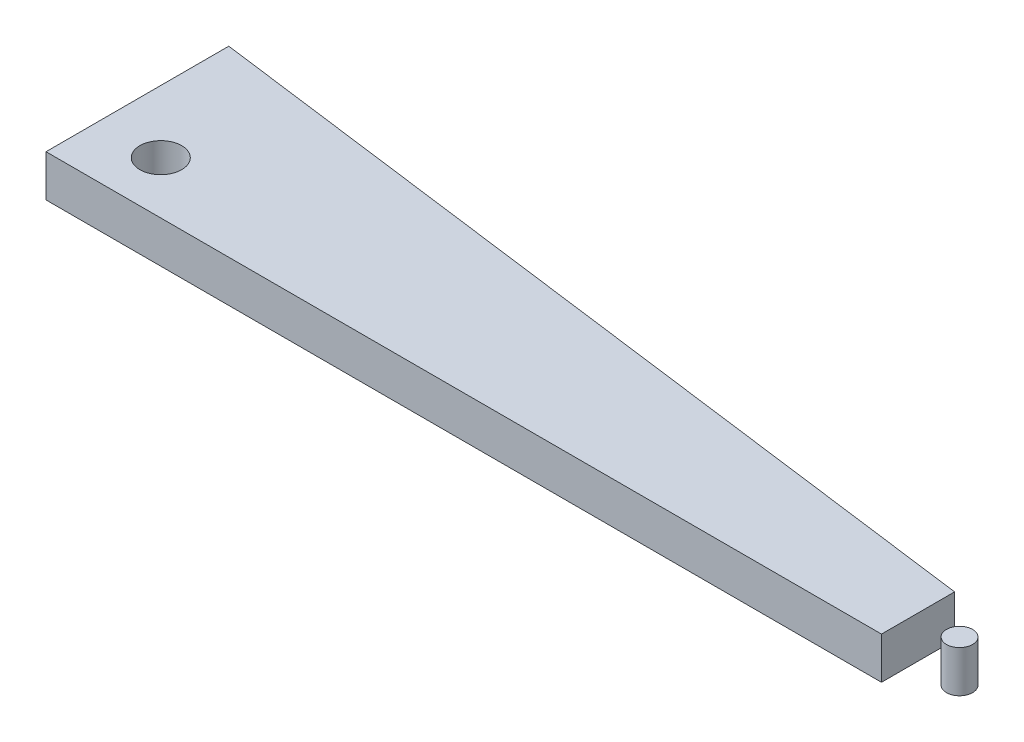
ISO-10303-21;
HEADER;
FILE_DESCRIPTION(('STEP AP214'),'2;1');
FILE_NAME('part.step','',(''),(''),'','','');
FILE_SCHEMA(('AUTOMOTIVE_DESIGN { 1 0 10303 214 1 1 1 1 }'));
ENDSEC;
DATA;
#1=APPLICATION_CONTEXT('core data for automotive mechanical design processes');
#2=APPLICATION_PROTOCOL_DEFINITION('international standard','automotive_design',2000,#1);
#3=PRODUCT_CONTEXT('',#1,'mechanical');
#4=PRODUCT('Part','Part','',(#3));
#5=PRODUCT_RELATED_PRODUCT_CATEGORY('part','',(#4));
#6=PRODUCT_DEFINITION_FORMATION('','',#4);
#7=PRODUCT_DEFINITION_CONTEXT('part definition',#1,'design');
#8=PRODUCT_DEFINITION('design','',#6,#7);
#9=PRODUCT_DEFINITION_SHAPE('','',#8);
#10=(LENGTH_UNIT() NAMED_UNIT(*) SI_UNIT(.MILLI.,.METRE.));
#11=(NAMED_UNIT(*) PLANE_ANGLE_UNIT() SI_UNIT($,.RADIAN.));
#12=(NAMED_UNIT(*) SI_UNIT($,.STERADIAN.) SOLID_ANGLE_UNIT());
#13=UNCERTAINTY_MEASURE_WITH_UNIT(LENGTH_MEASURE(1.E-05),#10,'distance_accuracy_value','');
#14=(GEOMETRIC_REPRESENTATION_CONTEXT(3) GLOBAL_UNCERTAINTY_ASSIGNED_CONTEXT((#13)) GLOBAL_UNIT_ASSIGNED_CONTEXT((#10,
#11,#12)) REPRESENTATION_CONTEXT('',''));
#15=CARTESIAN_POINT('',(0.,0.,0.));
#16=DIRECTION('',(0.,0.,1.));
#17=DIRECTION('',(1.,0.,0.));
#18=AXIS2_PLACEMENT_3D('',#15,#16,#17);
#19=CARTESIAN_POINT('',(167.947390467735,8.,-7.));
#20=DIRECTION('',(0.,-1.,0.));
#21=DIRECTION('',(0.,0.,-1.));
#22=AXIS2_PLACEMENT_3D('',#19,#20,#21);
#23=CYLINDRICAL_SURFACE('',#22,2.5);
#24=CARTESIAN_POINT('',(167.947390467735,8.,-7.));
#25=DIRECTION('',(0.,1.,0.));
#26=DIRECTION('',(0.,0.,1.));
#27=AXIS2_PLACEMENT_3D('',#24,#25,#26);
#28=CIRCLE('',#27,2.5);
#29=CARTESIAN_POINT('',(167.947390467735,8.,-4.5));
#30=VERTEX_POINT('',#29);
#31=EDGE_CURVE('E59',#30,#30,#28,.T.);
#32=ORIENTED_EDGE('',*,*,#31,.F.);
#33=EDGE_LOOP('',(#32));
#34=FACE_BOUND('',#33,.T.);
#35=CARTESIAN_POINT('',(167.947390467735,0.,-7.));
#36=DIRECTION('',(0.,1.,0.));
#37=DIRECTION('',(0.,0.,1.));
#38=AXIS2_PLACEMENT_3D('',#35,#36,#37);
#39=CIRCLE('',#38,2.5);
#40=CARTESIAN_POINT('',(167.947390467735,0.,-4.5));
#41=VERTEX_POINT('',#40);
#42=EDGE_CURVE('E11',#41,#41,#39,.T.);
#43=ORIENTED_EDGE('',*,*,#42,.T.);
#44=EDGE_LOOP('',(#43));
#45=FACE_BOUND('',#44,.T.);
#46=ADVANCED_FACE('F55',(#34,#45),#23,.T.);
#47=CARTESIAN_POINT('',(167.947390467735,8.,-7.));
#48=DIRECTION('',(0.,1.,0.));
#49=DIRECTION('',(0.,0.,1.));
#50=AXIS2_PLACEMENT_3D('',#47,#48,#49);
#51=PLANE('',#50);
#52=ORIENTED_EDGE('',*,*,#31,.T.);
#53=EDGE_LOOP('',(#52));
#54=FACE_BOUND('',#53,.T.);
#55=ADVANCED_FACE('F57',(#54),#51,.T.);
#56=CARTESIAN_POINT('',(167.947390467735,0.,-7.));
#57=DIRECTION('',(0.,1.,0.));
#58=DIRECTION('',(0.,0.,1.));
#59=AXIS2_PLACEMENT_3D('',#56,#57,#58);
#60=PLANE('',#59);
#61=ORIENTED_EDGE('',*,*,#42,.F.);
#62=EDGE_LOOP('',(#61));
#63=FACE_BOUND('',#62,.T.);
#64=ADVANCED_FACE('F74',(#63),#60,.F.);
#65=CLOSED_SHELL('',(#46,#55,#64));
#66=MANIFOLD_SOLID_BREP('B2',#65);
#67=CARTESIAN_POINT('',(0.,8.,0.));
#68=DIRECTION('',(0.,-1.,0.));
#69=DIRECTION('',(0.,0.,-1.));
#70=AXIS2_PLACEMENT_3D('',#67,#68,#69);
#71=PLANE('',#70);
#72=DIRECTION('',(0.,0.,1.));
#73=VECTOR('',#72,1.);
#74=CARTESIAN_POINT('',(0.,8.,0.));
#75=LINE('',#74,#73);
#76=CARTESIAN_POINT('',(0.,8.,-35.));
#77=VERTEX_POINT('',#76);
#78=CARTESIAN_POINT('',(0.,8.,0.));
#79=VERTEX_POINT('',#78);
#80=EDGE_CURVE('E149',#77,#79,#75,.T.);
#81=ORIENTED_EDGE('',*,*,#80,.T.);
#82=DIRECTION('',(1.,0.,0.));
#83=VECTOR('',#82,1.);
#84=CARTESIAN_POINT('',(0.,8.,0.));
#85=LINE('',#84,#83);
#86=CARTESIAN_POINT('',(160.,8.,0.));
#87=VERTEX_POINT('',#86);
#88=EDGE_CURVE('E144',#79,#87,#85,.T.);
#89=ORIENTED_EDGE('',*,*,#88,.T.);
#90=DIRECTION('',(0.,0.,-1.));
#91=VECTOR('',#90,1.);
#92=CARTESIAN_POINT('',(160.,8.,0.));
#93=LINE('',#92,#91);
#94=CARTESIAN_POINT('',(160.,8.,-14.));
#95=VERTEX_POINT('',#94);
#96=EDGE_CURVE('E147',#87,#95,#93,.T.);
#97=ORIENTED_EDGE('',*,*,#96,.T.);
#98=DIRECTION('',(-0.9914964278646,0.,-0.130133906157229));
#99=VECTOR('',#98,1.);
#100=CARTESIAN_POINT('',(0.,8.,-35.));
#101=LINE('',#100,#99);
#102=EDGE_CURVE('E114',#95,#77,#101,.T.);
#103=ORIENTED_EDGE('',*,*,#102,.T.);
#104=EDGE_LOOP('',(#81,#89,#97,#103));
#105=FACE_BOUND('',#104,.T.);
#106=CARTESIAN_POINT('',(11.9788961630004,8.,-10.));
#107=DIRECTION('',(0.,1.,0.));
#108=DIRECTION('',(0.,0.,1.));
#109=AXIS2_PLACEMENT_3D('',#106,#107,#108);
#110=CIRCLE('',#109,4.);
#111=CARTESIAN_POINT('',(11.9788961630004,8.,-6.));
#112=VERTEX_POINT('',#111);
#113=EDGE_CURVE('E169',#112,#112,#110,.T.);
#114=ORIENTED_EDGE('',*,*,#113,.F.);
#115=EDGE_LOOP('',(#114));
#116=FACE_BOUND('',#115,.T.);
#117=ADVANCED_FACE('F96',(#105,#116),#71,.F.);
#118=CARTESIAN_POINT('',(0.,0.,0.));
#119=DIRECTION('',(0.,-1.,0.));
#120=DIRECTION('',(0.,0.,-1.));
#121=AXIS2_PLACEMENT_3D('',#118,#119,#120);
#122=PLANE('',#121);
#123=DIRECTION('',(0.,0.,1.));
#124=VECTOR('',#123,1.);
#125=CARTESIAN_POINT('',(0.,0.,0.));
#126=LINE('',#125,#124);
#127=CARTESIAN_POINT('',(0.,0.,-35.));
#128=VERTEX_POINT('',#127);
#129=CARTESIAN_POINT('',(0.,0.,0.));
#130=VERTEX_POINT('',#129);
#131=EDGE_CURVE('E165',#128,#130,#126,.T.);
#132=ORIENTED_EDGE('',*,*,#131,.F.);
#133=DIRECTION('',(-0.9914964278646,0.,-0.130133906157229));
#134=VECTOR('',#133,1.);
#135=CARTESIAN_POINT('',(0.,0.,-35.));
#136=LINE('',#135,#134);
#137=CARTESIAN_POINT('',(160.,0.,-14.));
#138=VERTEX_POINT('',#137);
#139=EDGE_CURVE('E137',#138,#128,#136,.T.);
#140=ORIENTED_EDGE('',*,*,#139,.F.);
#141=DIRECTION('',(0.,0.,-1.));
#142=VECTOR('',#141,1.);
#143=CARTESIAN_POINT('',(160.,0.,0.));
#144=LINE('',#143,#142);
#145=CARTESIAN_POINT('',(160.,0.,0.));
#146=VERTEX_POINT('',#145);
#147=EDGE_CURVE('E131',#146,#138,#144,.T.);
#148=ORIENTED_EDGE('',*,*,#147,.F.);
#149=DIRECTION('',(1.,0.,0.));
#150=VECTOR('',#149,1.);
#151=CARTESIAN_POINT('',(0.,0.,0.));
#152=LINE('',#151,#150);
#153=EDGE_CURVE('E154',#130,#146,#152,.T.);
#154=ORIENTED_EDGE('',*,*,#153,.F.);
#155=EDGE_LOOP('',(#132,#140,#148,#154));
#156=FACE_BOUND('',#155,.T.);
#157=CARTESIAN_POINT('',(11.9788961630004,0.,-10.));
#158=DIRECTION('',(0.,1.,0.));
#159=DIRECTION('',(0.,0.,1.));
#160=AXIS2_PLACEMENT_3D('',#157,#158,#159);
#161=CIRCLE('',#160,4.);
#162=CARTESIAN_POINT('',(11.9788961630004,0.,-6.));
#163=VERTEX_POINT('',#162);
#164=EDGE_CURVE('E187',#163,#163,#161,.T.);
#165=ORIENTED_EDGE('',*,*,#164,.T.);
#166=EDGE_LOOP('',(#165));
#167=FACE_BOUND('',#166,.T.);
#168=ADVANCED_FACE('F182',(#156,#167),#122,.T.);
#169=CARTESIAN_POINT('',(0.,8.,0.));
#170=DIRECTION('',(1.,0.,0.));
#171=DIRECTION('',(0.,0.,-1.));
#172=AXIS2_PLACEMENT_3D('',#169,#170,#171);
#173=PLANE('',#172);
#174=ORIENTED_EDGE('',*,*,#131,.T.);
#175=DIRECTION('',(0.,-1.,0.));
#176=VECTOR('',#175,1.);
#177=CARTESIAN_POINT('',(0.,8.,0.));
#178=LINE('',#177,#176);
#179=EDGE_CURVE('E53',#79,#130,#178,.T.);
#180=ORIENTED_EDGE('',*,*,#179,.F.);
#181=ORIENTED_EDGE('',*,*,#80,.F.);
#182=DIRECTION('',(0.,-1.,0.));
#183=VECTOR('',#182,1.);
#184=CARTESIAN_POINT('',(0.,8.,-35.));
#185=LINE('',#184,#183);
#186=EDGE_CURVE('E161',#77,#128,#185,.T.);
#187=ORIENTED_EDGE('',*,*,#186,.T.);
#188=EDGE_LOOP('',(#174,#180,#181,#187));
#189=FACE_BOUND('',#188,.T.);
#190=ADVANCED_FACE('F98',(#189),#173,.F.);
#191=CARTESIAN_POINT('',(0.,8.,0.));
#192=DIRECTION('',(0.,0.,-1.));
#193=DIRECTION('',(-1.,0.,0.));
#194=AXIS2_PLACEMENT_3D('',#191,#192,#193);
#195=PLANE('',#194);
#196=ORIENTED_EDGE('',*,*,#153,.T.);
#197=DIRECTION('',(0.,-1.,0.));
#198=VECTOR('',#197,1.);
#199=CARTESIAN_POINT('',(160.,8.,0.));
#200=LINE('',#199,#198);
#201=EDGE_CURVE('E106',#87,#146,#200,.T.);
#202=ORIENTED_EDGE('',*,*,#201,.F.);
#203=ORIENTED_EDGE('',*,*,#88,.F.);
#204=ORIENTED_EDGE('',*,*,#179,.T.);
#205=EDGE_LOOP('',(#196,#202,#203,#204));
#206=FACE_BOUND('',#205,.T.);
#207=ADVANCED_FACE('F153',(#206),#195,.F.);
#208=CARTESIAN_POINT('',(160.,8.,0.));
#209=DIRECTION('',(-1.,0.,0.));
#210=DIRECTION('',(0.,0.,1.));
#211=AXIS2_PLACEMENT_3D('',#208,#209,#210);
#212=PLANE('',#211);
#213=ORIENTED_EDGE('',*,*,#147,.T.);
#214=DIRECTION('',(0.,-1.,0.));
#215=VECTOR('',#214,1.);
#216=CARTESIAN_POINT('',(160.,8.,-14.));
#217=LINE('',#216,#215);
#218=EDGE_CURVE('E156',#95,#138,#217,.T.);
#219=ORIENTED_EDGE('',*,*,#218,.F.);
#220=ORIENTED_EDGE('',*,*,#96,.F.);
#221=ORIENTED_EDGE('',*,*,#201,.T.);
#222=EDGE_LOOP('',(#213,#219,#220,#221));
#223=FACE_BOUND('',#222,.T.);
#224=ADVANCED_FACE('F157',(#223),#212,.F.);
#225=CARTESIAN_POINT('',(0.,8.,-35.));
#226=DIRECTION('',(-0.130133906157229,0.,0.9914964278646));
#227=DIRECTION('',(0.9914964278646,0.,0.130133906157229));
#228=AXIS2_PLACEMENT_3D('',#225,#226,#227);
#229=PLANE('',#228);
#230=ORIENTED_EDGE('',*,*,#139,.T.);
#231=ORIENTED_EDGE('',*,*,#186,.F.);
#232=ORIENTED_EDGE('',*,*,#102,.F.);
#233=ORIENTED_EDGE('',*,*,#218,.T.);
#234=EDGE_LOOP('',(#230,#231,#232,#233));
#235=FACE_BOUND('',#234,.T.);
#236=ADVANCED_FACE('F179',(#235),#229,.F.);
#237=CARTESIAN_POINT('',(11.9788961630004,8.,-10.));
#238=DIRECTION('',(0.,-1.,0.));
#239=DIRECTION('',(0.,0.,-1.));
#240=AXIS2_PLACEMENT_3D('',#237,#238,#239);
#241=CYLINDRICAL_SURFACE('',#240,4.);
#242=ORIENTED_EDGE('',*,*,#113,.T.);
#243=EDGE_LOOP('',(#242));
#244=FACE_BOUND('',#243,.T.);
#245=ORIENTED_EDGE('',*,*,#164,.F.);
#246=EDGE_LOOP('',(#245));
#247=FACE_BOUND('',#246,.T.);
#248=ADVANCED_FACE('F195',(#244,#247),#241,.F.);
#249=CLOSED_SHELL('',(#117,#168,#190,#207,#224,#236,#248));
#250=MANIFOLD_SOLID_BREP('B6',#249);
#251=ADVANCED_BREP_SHAPE_REPRESENTATION('',(#18,#66,#250),#14);
#252=SHAPE_DEFINITION_REPRESENTATION(#9,#251);
ENDSEC;
END-ISO-10303-21;
